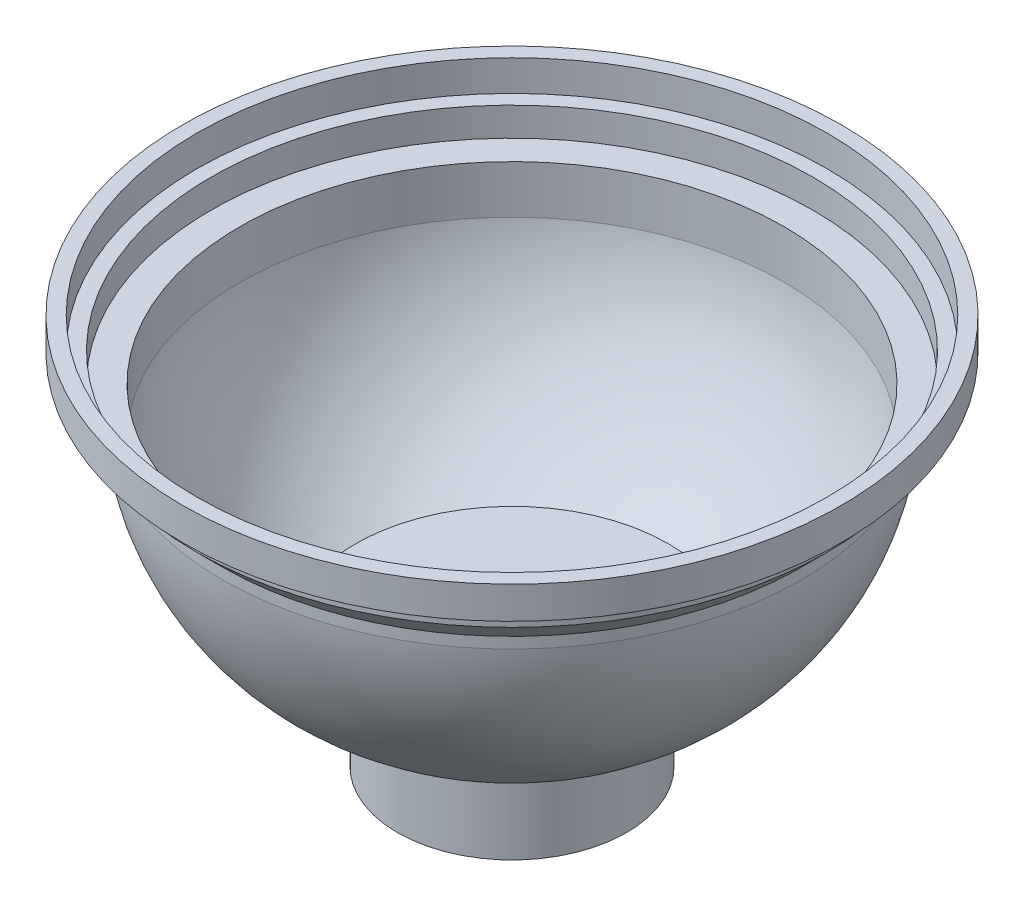
ISO-10303-21;
HEADER;
FILE_DESCRIPTION(('STEP AP214'),'2;1');
FILE_NAME('part.step','',(''),(''),'','','');
FILE_SCHEMA(('AUTOMOTIVE_DESIGN { 1 0 10303 214 1 1 1 1 }'));
ENDSEC;
DATA;
#1=APPLICATION_CONTEXT('core data for automotive mechanical design processes');
#2=APPLICATION_PROTOCOL_DEFINITION('international standard','automotive_design',2000,#1);
#3=PRODUCT_CONTEXT('',#1,'mechanical');
#4=PRODUCT('Part','Part','',(#3));
#5=PRODUCT_RELATED_PRODUCT_CATEGORY('part','',(#4));
#6=PRODUCT_DEFINITION_FORMATION('','',#4);
#7=PRODUCT_DEFINITION_CONTEXT('part definition',#1,'design');
#8=PRODUCT_DEFINITION('design','',#6,#7);
#9=PRODUCT_DEFINITION_SHAPE('','',#8);
#10=(LENGTH_UNIT() NAMED_UNIT(*) SI_UNIT(.MILLI.,.METRE.));
#11=(NAMED_UNIT(*) PLANE_ANGLE_UNIT() SI_UNIT($,.RADIAN.));
#12=(NAMED_UNIT(*) SI_UNIT($,.STERADIAN.) SOLID_ANGLE_UNIT());
#13=UNCERTAINTY_MEASURE_WITH_UNIT(LENGTH_MEASURE(1.E-05),#10,'distance_accuracy_value','');
#14=(GEOMETRIC_REPRESENTATION_CONTEXT(3) GLOBAL_UNCERTAINTY_ASSIGNED_CONTEXT((#13)) GLOBAL_UNIT_ASSIGNED_CONTEXT((#10,
#11,#12)) REPRESENTATION_CONTEXT('',''));
#15=CARTESIAN_POINT('',(0.,0.,0.));
#16=DIRECTION('',(0.,0.,1.));
#17=DIRECTION('',(1.,0.,0.));
#18=AXIS2_PLACEMENT_3D('',#15,#16,#17);
#19=CARTESIAN_POINT('',(30.,0.,0.));
#20=DIRECTION('',(0.,1.,0.));
#21=DIRECTION('',(0.,0.,1.));
#22=AXIS2_PLACEMENT_3D('',#19,#20,#21);
#23=PLANE('',#22);
#24=CARTESIAN_POINT('',(0.,0.,0.));
#25=DIRECTION('',(0.,1.,0.));
#26=DIRECTION('',(0.,0.,1.));
#27=AXIS2_PLACEMENT_3D('',#24,#25,#26);
#28=CIRCLE('',#27,40.);
#29=CARTESIAN_POINT('',(0.,0.,40.));
#30=VERTEX_POINT('',#29);
#31=EDGE_CURVE('E10',#30,#30,#28,.T.);
#32=ORIENTED_EDGE('',*,*,#31,.F.);
#33=EDGE_LOOP('',(#32));
#34=FACE_BOUND('',#33,.T.);
#35=CARTESIAN_POINT('',(0.,0.,0.));
#36=DIRECTION('',(0.,1.,0.));
#37=DIRECTION('',(0.,0.,1.));
#38=AXIS2_PLACEMENT_3D('',#35,#36,#37);
#39=CIRCLE('',#38,30.);
#40=CARTESIAN_POINT('',(0.,0.,30.));
#41=VERTEX_POINT('',#40);
#42=EDGE_CURVE('E103',#41,#41,#39,.T.);
#43=ORIENTED_EDGE('',*,*,#42,.T.);
#44=EDGE_LOOP('',(#43));
#45=FACE_BOUND('',#44,.T.);
#46=ADVANCED_FACE('F39',(#34,#45),#23,.F.);
#47=CARTESIAN_POINT('',(0.,50.4635761589404,0.));
#48=DIRECTION('',(0.,1.,0.));
#49=DIRECTION('',(0.,0.,1.));
#50=AXIS2_PLACEMENT_3D('',#47,#48,#49);
#51=CYLINDRICAL_SURFACE('',#50,40.);
#52=CARTESIAN_POINT('',(0.,30.,0.));
#53=DIRECTION('',(0.,1.,0.));
#54=DIRECTION('',(0.,0.,1.));
#55=AXIS2_PLACEMENT_3D('',#52,#53,#54);
#56=CIRCLE('',#55,40.);
#57=CARTESIAN_POINT('',(0.,30.,40.));
#58=VERTEX_POINT('',#57);
#59=EDGE_CURVE('E45',#58,#58,#56,.T.);
#60=ORIENTED_EDGE('',*,*,#59,.F.);
#61=EDGE_LOOP('',(#60));
#62=FACE_BOUND('',#61,.T.);
#63=ORIENTED_EDGE('',*,*,#31,.T.);
#64=EDGE_LOOP('',(#63));
#65=FACE_BOUND('',#64,.T.);
#66=ADVANCED_FACE('F212',(#62,#65),#51,.T.);
#67=CARTESIAN_POINT('',(40.,30.,0.));
#68=DIRECTION('',(0.,1.,0.));
#69=DIRECTION('',(0.,0.,1.));
#70=AXIS2_PLACEMENT_3D('',#67,#68,#69);
#71=PLANE('',#70);
#72=CARTESIAN_POINT('',(0.,30.,0.));
#73=DIRECTION('',(0.,1.,0.));
#74=DIRECTION('',(0.,0.,1.));
#75=AXIS2_PLACEMENT_3D('',#72,#73,#74);
#76=CIRCLE('',#75,45.7789956811034);
#77=CARTESIAN_POINT('',(0.,30.,45.7789956811034));
#78=VERTEX_POINT('',#77);
#79=EDGE_CURVE('E49',#78,#78,#76,.T.);
#80=ORIENTED_EDGE('',*,*,#79,.F.);
#81=EDGE_LOOP('',(#80));
#82=FACE_BOUND('',#81,.T.);
#83=ORIENTED_EDGE('',*,*,#59,.T.);
#84=EDGE_LOOP('',(#83));
#85=FACE_BOUND('',#84,.T.);
#86=ADVANCED_FACE('F207',(#82,#85),#71,.F.);
#87=CARTESIAN_POINT('',(0.,113.097256735167,0.));
#88=DIRECTION('',(0.,1.,0.));
#89=DIRECTION('',(0.,0.,1.));
#90=AXIS2_PLACEMENT_3D('',#87,#88,#89);
#91=DEGENERATE_TOROIDAL_SURFACE('',#90,11.2124522743684,90.,.T.);
#92=CARTESIAN_POINT('',(0.,106.889568848599,0.));
#93=DIRECTION('',(0.,1.,0.));
#94=DIRECTION('',(0.,0.,1.));
#95=AXIS2_PLACEMENT_3D('',#92,#93,#94);
#96=CIRCLE('',#95,100.998111547456);
#97=CARTESIAN_POINT('',(0.,106.889568848599,100.998111547456));
#98=VERTEX_POINT('',#97);
#99=EDGE_CURVE('E53',#98,#98,#96,.T.);
#100=ORIENTED_EDGE('',*,*,#99,.F.);
#101=EDGE_LOOP('',(#100));
#102=FACE_BOUND('',#101,.T.);
#103=ORIENTED_EDGE('',*,*,#79,.T.);
#104=EDGE_LOOP('',(#103));
#105=FACE_BOUND('',#104,.T.);
#106=ADVANCED_FACE('F201',(#102,#105),#91,.T.);
#107=CARTESIAN_POINT('',(0.,50.4635761589404,0.));
#108=DIRECTION('',(0.,1.,0.));
#109=DIRECTION('',(0.,0.,1.));
#110=AXIS2_PLACEMENT_3D('',#107,#108,#109);
#111=CYLINDRICAL_SURFACE('',#110,100.998111547456);
#112=CARTESIAN_POINT('',(0.,110.707348444746,0.));
#113=DIRECTION('',(0.,1.,0.));
#114=DIRECTION('',(0.,0.,1.));
#115=AXIS2_PLACEMENT_3D('',#112,#113,#114);
#116=CIRCLE('',#115,100.998111547456);
#117=CARTESIAN_POINT('',(0.,110.707348444746,100.998111547456));
#118=VERTEX_POINT('',#117);
#119=EDGE_CURVE('E58',#118,#118,#116,.T.);
#120=ORIENTED_EDGE('',*,*,#119,.F.);
#121=EDGE_LOOP('',(#120));
#122=FACE_BOUND('',#121,.T.);
#123=ORIENTED_EDGE('',*,*,#99,.T.);
#124=EDGE_LOOP('',(#123));
#125=FACE_BOUND('',#124,.T.);
#126=ADVANCED_FACE('F195',(#122,#125),#111,.T.);
#127=CARTESIAN_POINT('',(0.,110.707348444746,0.));
#128=DIRECTION('',(0.,1.,0.));
#129=DIRECTION('',(0.,0.,1.));
#130=AXIS2_PLACEMENT_3D('',#127,#128,#129);
#131=CONICAL_SURFACE('',#130,100.998111547456,0.785398163397448);
#132=CARTESIAN_POINT('',(0.,120.046904015415,0.));
#133=DIRECTION('',(0.,1.,0.));
#134=DIRECTION('',(0.,0.,1.));
#135=AXIS2_PLACEMENT_3D('',#132,#133,#134);
#136=CIRCLE('',#135,110.337667118125);
#137=CARTESIAN_POINT('',(0.,120.046904015415,110.337667118125));
#138=VERTEX_POINT('',#137);
#139=EDGE_CURVE('E61',#138,#138,#136,.T.);
#140=ORIENTED_EDGE('',*,*,#139,.F.);
#141=EDGE_LOOP('',(#140));
#142=FACE_BOUND('',#141,.T.);
#143=ORIENTED_EDGE('',*,*,#119,.T.);
#144=EDGE_LOOP('',(#143));
#145=FACE_BOUND('',#144,.T.);
#146=ADVANCED_FACE('F189',(#142,#145),#131,.T.);
#147=CARTESIAN_POINT('',(0.,50.4635761589404,0.));
#148=DIRECTION('',(0.,1.,0.));
#149=DIRECTION('',(0.,0.,1.));
#150=AXIS2_PLACEMENT_3D('',#147,#148,#149);
#151=CYLINDRICAL_SURFACE('',#150,110.337667118125);
#152=CARTESIAN_POINT('',(0.,125.152560563166,0.));
#153=DIRECTION('',(0.,1.,0.));
#154=DIRECTION('',(0.,0.,1.));
#155=AXIS2_PLACEMENT_3D('',#152,#153,#154);
#156=CIRCLE('',#155,110.337667118125);
#157=CARTESIAN_POINT('',(0.,125.152560563166,110.337667118125));
#158=VERTEX_POINT('',#157);
#159=EDGE_CURVE('E64',#158,#158,#156,.T.);
#160=ORIENTED_EDGE('',*,*,#159,.F.);
#161=EDGE_LOOP('',(#160));
#162=FACE_BOUND('',#161,.T.);
#163=ORIENTED_EDGE('',*,*,#139,.T.);
#164=EDGE_LOOP('',(#163));
#165=FACE_BOUND('',#164,.T.);
#166=ADVANCED_FACE('F183',(#162,#165),#151,.T.);
#167=CARTESIAN_POINT('',(115.,125.152560563166,0.));
#168=DIRECTION('',(0.,1.,0.));
#169=DIRECTION('',(0.,0.,1.));
#170=AXIS2_PLACEMENT_3D('',#167,#168,#169);
#171=PLANE('',#170);
#172=CARTESIAN_POINT('',(0.,125.152560563166,0.));
#173=DIRECTION('',(0.,1.,0.));
#174=DIRECTION('',(0.,0.,1.));
#175=AXIS2_PLACEMENT_3D('',#172,#173,#174);
#176=CIRCLE('',#175,115.);
#177=CARTESIAN_POINT('',(0.,125.152560563166,115.));
#178=VERTEX_POINT('',#177);
#179=EDGE_CURVE('E67',#178,#178,#176,.T.);
#180=ORIENTED_EDGE('',*,*,#179,.F.);
#181=EDGE_LOOP('',(#180));
#182=FACE_BOUND('',#181,.T.);
#183=ORIENTED_EDGE('',*,*,#159,.T.);
#184=EDGE_LOOP('',(#183));
#185=FACE_BOUND('',#184,.T.);
#186=ADVANCED_FACE('F177',(#182,#185),#171,.F.);
#187=CARTESIAN_POINT('',(0.,50.4635761589404,0.));
#188=DIRECTION('',(0.,1.,0.));
#189=DIRECTION('',(0.,0.,1.));
#190=AXIS2_PLACEMENT_3D('',#187,#188,#189);
#191=CYLINDRICAL_SURFACE('',#190,115.);
#192=CARTESIAN_POINT('',(0.,136.39105321781,0.));
#193=DIRECTION('',(0.,1.,0.));
#194=DIRECTION('',(0.,0.,1.));
#195=AXIS2_PLACEMENT_3D('',#192,#193,#194);
#196=CIRCLE('',#195,115.);
#197=CARTESIAN_POINT('',(0.,136.39105321781,115.));
#198=VERTEX_POINT('',#197);
#199=EDGE_CURVE('E70',#198,#198,#196,.T.);
#200=ORIENTED_EDGE('',*,*,#199,.F.);
#201=EDGE_LOOP('',(#200));
#202=FACE_BOUND('',#201,.T.);
#203=ORIENTED_EDGE('',*,*,#179,.T.);
#204=EDGE_LOOP('',(#203));
#205=FACE_BOUND('',#204,.T.);
#206=ADVANCED_FACE('F171',(#202,#205),#191,.T.);
#207=CARTESIAN_POINT('',(110.,136.39105321781,0.));
#208=DIRECTION('',(0.,-1.,0.));
#209=DIRECTION('',(0.,0.,-1.));
#210=AXIS2_PLACEMENT_3D('',#207,#208,#209);
#211=PLANE('',#210);
#212=CARTESIAN_POINT('',(0.,136.39105321781,0.));
#213=DIRECTION('',(0.,1.,0.));
#214=DIRECTION('',(0.,0.,1.));
#215=AXIS2_PLACEMENT_3D('',#212,#213,#214);
#216=CIRCLE('',#215,110.);
#217=CARTESIAN_POINT('',(0.,136.39105321781,110.));
#218=VERTEX_POINT('',#217);
#219=EDGE_CURVE('E73',#218,#218,#216,.T.);
#220=ORIENTED_EDGE('',*,*,#219,.F.);
#221=EDGE_LOOP('',(#220));
#222=FACE_BOUND('',#221,.T.);
#223=ORIENTED_EDGE('',*,*,#199,.T.);
#224=EDGE_LOOP('',(#223));
#225=FACE_BOUND('',#224,.T.);
#226=ADVANCED_FACE('F165',(#222,#225),#211,.F.);
#227=CARTESIAN_POINT('',(0.,50.4635761589404,0.));
#228=DIRECTION('',(0.,1.,0.));
#229=DIRECTION('',(0.,0.,1.));
#230=AXIS2_PLACEMENT_3D('',#227,#228,#229);
#231=CYLINDRICAL_SURFACE('',#230,110.);
#232=CARTESIAN_POINT('',(0.,125.608667148748,0.));
#233=DIRECTION('',(0.,1.,0.));
#234=DIRECTION('',(0.,0.,1.));
#235=AXIS2_PLACEMENT_3D('',#232,#233,#234);
#236=CIRCLE('',#235,110.);
#237=CARTESIAN_POINT('',(0.,125.608667148748,110.));
#238=VERTEX_POINT('',#237);
#239=EDGE_CURVE('E76',#238,#238,#236,.T.);
#240=ORIENTED_EDGE('',*,*,#239,.F.);
#241=EDGE_LOOP('',(#240));
#242=FACE_BOUND('',#241,.T.);
#243=ORIENTED_EDGE('',*,*,#219,.T.);
#244=EDGE_LOOP('',(#243));
#245=FACE_BOUND('',#244,.T.);
#246=ADVANCED_FACE('F159',(#242,#245),#231,.F.);
#247=CARTESIAN_POINT('',(105.,125.608667148748,0.));
#248=DIRECTION('',(0.,-1.,0.));
#249=DIRECTION('',(0.,0.,-1.));
#250=AXIS2_PLACEMENT_3D('',#247,#248,#249);
#251=PLANE('',#250);
#252=CARTESIAN_POINT('',(0.,125.608667148748,0.));
#253=DIRECTION('',(0.,1.,0.));
#254=DIRECTION('',(0.,0.,1.));
#255=AXIS2_PLACEMENT_3D('',#252,#253,#254);
#256=CIRCLE('',#255,105.);
#257=CARTESIAN_POINT('',(0.,125.608667148748,105.));
#258=VERTEX_POINT('',#257);
#259=EDGE_CURVE('E79',#258,#258,#256,.T.);
#260=ORIENTED_EDGE('',*,*,#259,.F.);
#261=EDGE_LOOP('',(#260));
#262=FACE_BOUND('',#261,.T.);
#263=ORIENTED_EDGE('',*,*,#239,.T.);
#264=EDGE_LOOP('',(#263));
#265=FACE_BOUND('',#264,.T.);
#266=ADVANCED_FACE('F153',(#262,#265),#251,.F.);
#267=CARTESIAN_POINT('',(0.,50.4635761589404,0.));
#268=DIRECTION('',(0.,1.,0.));
#269=DIRECTION('',(0.,0.,1.));
#270=AXIS2_PLACEMENT_3D('',#267,#268,#269);
#271=CYLINDRICAL_SURFACE('',#270,105.);
#272=CARTESIAN_POINT('',(0.,115.608667148748,0.));
#273=DIRECTION('',(0.,1.,0.));
#274=DIRECTION('',(0.,0.,1.));
#275=AXIS2_PLACEMENT_3D('',#272,#273,#274);
#276=CIRCLE('',#275,105.);
#277=CARTESIAN_POINT('',(0.,115.608667148748,105.));
#278=VERTEX_POINT('',#277);
#279=EDGE_CURVE('E82',#278,#278,#276,.T.);
#280=ORIENTED_EDGE('',*,*,#279,.F.);
#281=EDGE_LOOP('',(#280));
#282=FACE_BOUND('',#281,.T.);
#283=ORIENTED_EDGE('',*,*,#259,.T.);
#284=EDGE_LOOP('',(#283));
#285=FACE_BOUND('',#284,.T.);
#286=ADVANCED_FACE('F147',(#282,#285),#271,.F.);
#287=CARTESIAN_POINT('',(95.,115.608667148748,0.));
#288=DIRECTION('',(0.,-1.,0.));
#289=DIRECTION('',(0.,0.,-1.));
#290=AXIS2_PLACEMENT_3D('',#287,#288,#289);
#291=PLANE('',#290);
#292=CARTESIAN_POINT('',(0.,115.608667148748,0.));
#293=DIRECTION('',(0.,1.,0.));
#294=DIRECTION('',(0.,0.,1.));
#295=AXIS2_PLACEMENT_3D('',#292,#293,#294);
#296=CIRCLE('',#295,95.);
#297=CARTESIAN_POINT('',(0.,115.608667148748,95.));
#298=VERTEX_POINT('',#297);
#299=EDGE_CURVE('E85',#298,#298,#296,.T.);
#300=ORIENTED_EDGE('',*,*,#299,.F.);
#301=EDGE_LOOP('',(#300));
#302=FACE_BOUND('',#301,.T.);
#303=ORIENTED_EDGE('',*,*,#279,.T.);
#304=EDGE_LOOP('',(#303));
#305=FACE_BOUND('',#304,.T.);
#306=ADVANCED_FACE('F141',(#302,#305),#291,.F.);
#307=CARTESIAN_POINT('',(0.,50.4635761589404,0.));
#308=DIRECTION('',(0.,1.,0.));
#309=DIRECTION('',(0.,0.,1.));
#310=AXIS2_PLACEMENT_3D('',#307,#308,#309);
#311=CYLINDRICAL_SURFACE('',#310,95.);
#312=CARTESIAN_POINT('',(0.,98.7917736561162,0.));
#313=DIRECTION('',(0.,1.,0.));
#314=DIRECTION('',(0.,0.,1.));
#315=AXIS2_PLACEMENT_3D('',#312,#313,#314);
#316=CIRCLE('',#315,95.);
#317=CARTESIAN_POINT('',(0.,98.7917736561162,95.));
#318=VERTEX_POINT('',#317);
#319=EDGE_CURVE('E88',#318,#318,#316,.T.);
#320=ORIENTED_EDGE('',*,*,#319,.F.);
#321=EDGE_LOOP('',(#320));
#322=FACE_BOUND('',#321,.T.);
#323=ORIENTED_EDGE('',*,*,#299,.T.);
#324=EDGE_LOOP('',(#323));
#325=FACE_BOUND('',#324,.T.);
#326=ADVANCED_FACE('F135',(#322,#325),#311,.F.);
#327=CARTESIAN_POINT('',(0.,113.097256735167,0.));
#328=DIRECTION('',(0.,1.,0.));
#329=DIRECTION('',(0.,0.,1.));
#330=AXIS2_PLACEMENT_3D('',#327,#328,#329);
#331=DEGENERATE_TOROIDAL_SURFACE('',#330,11.2124522743684,85.,.T.);
#332=CARTESIAN_POINT('',(0.,40.,0.));
#333=DIRECTION('',(0.,1.,0.));
#334=DIRECTION('',(0.,0.,1.));
#335=AXIS2_PLACEMENT_3D('',#332,#333,#334);
#336=CIRCLE('',#335,54.5920679687593);
#337=CARTESIAN_POINT('',(0.,40.,54.5920679687593));
#338=VERTEX_POINT('',#337);
#339=EDGE_CURVE('E91',#338,#338,#336,.T.);
#340=ORIENTED_EDGE('',*,*,#339,.F.);
#341=EDGE_LOOP('',(#340));
#342=FACE_BOUND('',#341,.T.);
#343=ORIENTED_EDGE('',*,*,#319,.T.);
#344=EDGE_LOOP('',(#343));
#345=FACE_BOUND('',#344,.T.);
#346=ADVANCED_FACE('F129',(#342,#345),#331,.F.);
#347=CARTESIAN_POINT('',(15.,40.,0.));
#348=DIRECTION('',(0.,-1.,0.));
#349=DIRECTION('',(0.,0.,-1.));
#350=AXIS2_PLACEMENT_3D('',#347,#348,#349);
#351=PLANE('',#350);
#352=CARTESIAN_POINT('',(0.,40.,0.));
#353=DIRECTION('',(0.,1.,0.));
#354=DIRECTION('',(0.,0.,1.));
#355=AXIS2_PLACEMENT_3D('',#352,#353,#354);
#356=CIRCLE('',#355,15.);
#357=CARTESIAN_POINT('',(0.,40.,15.));
#358=VERTEX_POINT('',#357);
#359=EDGE_CURVE('E94',#358,#358,#356,.T.);
#360=ORIENTED_EDGE('',*,*,#359,.F.);
#361=EDGE_LOOP('',(#360));
#362=FACE_BOUND('',#361,.T.);
#363=ORIENTED_EDGE('',*,*,#339,.T.);
#364=EDGE_LOOP('',(#363));
#365=FACE_BOUND('',#364,.T.);
#366=ADVANCED_FACE('F123',(#362,#365),#351,.F.);
#367=CARTESIAN_POINT('',(0.,50.4635761589404,0.));
#368=DIRECTION('',(0.,1.,0.));
#369=DIRECTION('',(0.,0.,1.));
#370=AXIS2_PLACEMENT_3D('',#367,#368,#369);
#371=CYLINDRICAL_SURFACE('',#370,15.);
#372=CARTESIAN_POINT('',(0.,35.,0.));
#373=DIRECTION('',(0.,1.,0.));
#374=DIRECTION('',(0.,0.,1.));
#375=AXIS2_PLACEMENT_3D('',#372,#373,#374);
#376=CIRCLE('',#375,15.);
#377=CARTESIAN_POINT('',(0.,35.,15.));
#378=VERTEX_POINT('',#377);
#379=EDGE_CURVE('E97',#378,#378,#376,.T.);
#380=ORIENTED_EDGE('',*,*,#379,.F.);
#381=EDGE_LOOP('',(#380));
#382=FACE_BOUND('',#381,.T.);
#383=ORIENTED_EDGE('',*,*,#359,.T.);
#384=EDGE_LOOP('',(#383));
#385=FACE_BOUND('',#384,.T.);
#386=ADVANCED_FACE('F117',(#382,#385),#371,.F.);
#387=CARTESIAN_POINT('',(30.,35.,0.));
#388=DIRECTION('',(0.,1.,0.));
#389=DIRECTION('',(0.,0.,1.));
#390=AXIS2_PLACEMENT_3D('',#387,#388,#389);
#391=PLANE('',#390);
#392=CARTESIAN_POINT('',(0.,35.,0.));
#393=DIRECTION('',(0.,1.,0.));
#394=DIRECTION('',(0.,0.,1.));
#395=AXIS2_PLACEMENT_3D('',#392,#393,#394);
#396=CIRCLE('',#395,30.);
#397=CARTESIAN_POINT('',(0.,35.,30.));
#398=VERTEX_POINT('',#397);
#399=EDGE_CURVE('E100',#398,#398,#396,.T.);
#400=ORIENTED_EDGE('',*,*,#399,.F.);
#401=EDGE_LOOP('',(#400));
#402=FACE_BOUND('',#401,.T.);
#403=ORIENTED_EDGE('',*,*,#379,.T.);
#404=EDGE_LOOP('',(#403));
#405=FACE_BOUND('',#404,.T.);
#406=ADVANCED_FACE('F111',(#402,#405),#391,.F.);
#407=CARTESIAN_POINT('',(0.,50.4635761589404,0.));
#408=DIRECTION('',(0.,1.,0.));
#409=DIRECTION('',(0.,0.,1.));
#410=AXIS2_PLACEMENT_3D('',#407,#408,#409);
#411=CYLINDRICAL_SURFACE('',#410,30.);
#412=ORIENTED_EDGE('',*,*,#42,.F.);
#413=EDGE_LOOP('',(#412));
#414=FACE_BOUND('',#413,.T.);
#415=ORIENTED_EDGE('',*,*,#399,.T.);
#416=EDGE_LOOP('',(#415));
#417=FACE_BOUND('',#416,.T.);
#418=ADVANCED_FACE('F108',(#414,#417),#411,.F.);
#419=CLOSED_SHELL('',(#46,#66,#86,#106,#126,#146,#166,#186,#206,#226,#246,#266,#286,#306,#326,
#346,#366,#386,#406,#418));
#420=MANIFOLD_SOLID_BREP('B2',#419);
#421=ADVANCED_BREP_SHAPE_REPRESENTATION('',(#18,#420),#14);
#422=SHAPE_DEFINITION_REPRESENTATION(#9,#421);
ENDSEC;
END-ISO-10303-21;
